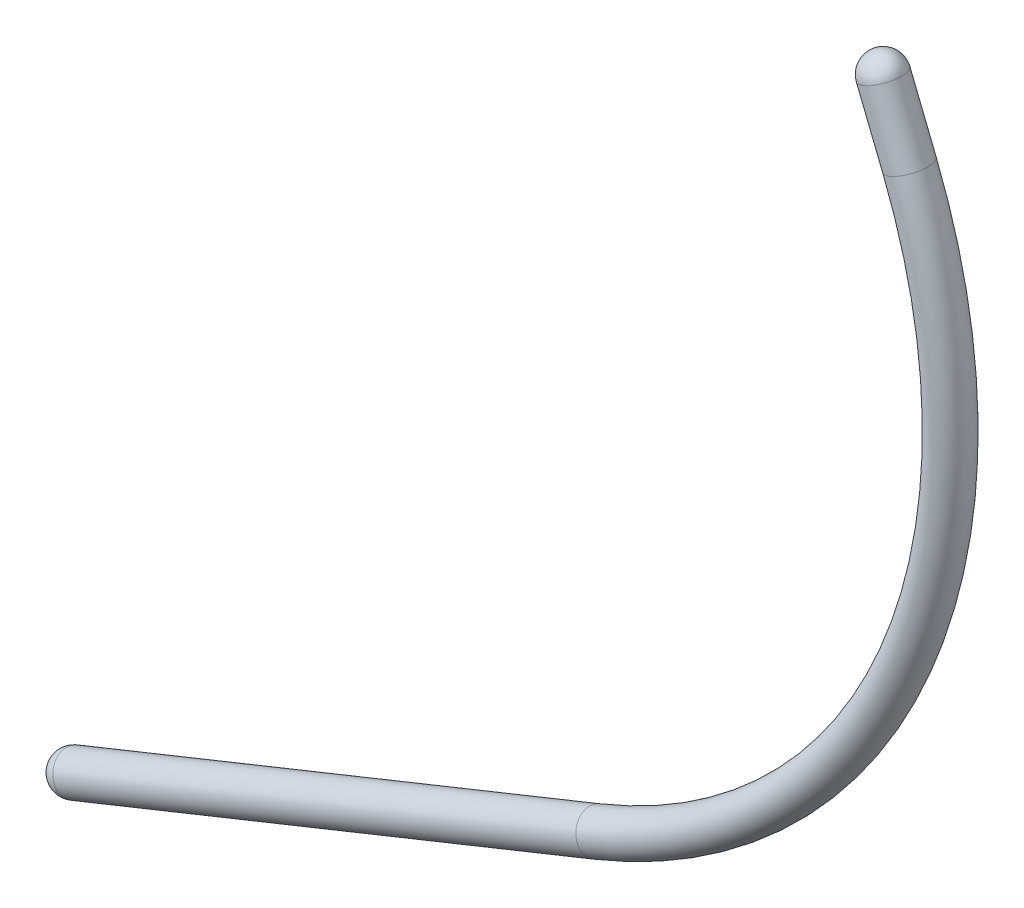
ISO-10303-21;
HEADER;
FILE_DESCRIPTION(('STEP AP214'),'2;1');
FILE_NAME('part.step','',(''),(''),'','','');
FILE_SCHEMA(('AUTOMOTIVE_DESIGN { 1 0 10303 214 1 1 1 1 }'));
ENDSEC;
DATA;
#1=APPLICATION_CONTEXT('core data for automotive mechanical design processes');
#2=APPLICATION_PROTOCOL_DEFINITION('international standard','automotive_design',2000,#1);
#3=PRODUCT_CONTEXT('',#1,'mechanical');
#4=PRODUCT('Part','Part','',(#3));
#5=PRODUCT_RELATED_PRODUCT_CATEGORY('part','',(#4));
#6=PRODUCT_DEFINITION_FORMATION('','',#4);
#7=PRODUCT_DEFINITION_CONTEXT('part definition',#1,'design');
#8=PRODUCT_DEFINITION('design','',#6,#7);
#9=PRODUCT_DEFINITION_SHAPE('','',#8);
#10=(LENGTH_UNIT() NAMED_UNIT(*) SI_UNIT(.MILLI.,.METRE.));
#11=(NAMED_UNIT(*) PLANE_ANGLE_UNIT() SI_UNIT($,.RADIAN.));
#12=(NAMED_UNIT(*) SI_UNIT($,.STERADIAN.) SOLID_ANGLE_UNIT());
#13=UNCERTAINTY_MEASURE_WITH_UNIT(LENGTH_MEASURE(1.E-05),#10,'distance_accuracy_value','');
#14=(GEOMETRIC_REPRESENTATION_CONTEXT(3) GLOBAL_UNCERTAINTY_ASSIGNED_CONTEXT((#13)) GLOBAL_UNIT_ASSIGNED_CONTEXT((#10,
#11,#12)) REPRESENTATION_CONTEXT('',''));
#15=CARTESIAN_POINT('',(0.,0.,0.));
#16=DIRECTION('',(0.,0.,1.));
#17=DIRECTION('',(1.,0.,0.));
#18=AXIS2_PLACEMENT_3D('',#15,#16,#17);
#19=CARTESIAN_POINT('',(-22.2587759214956,79.972270586641,0.));
#20=DIRECTION('',(0.373333333333334,-0.927697268629277,0.));
#21=DIRECTION('',(0.927697268629278,0.373333333333334,0.));
#22=AXIS2_PLACEMENT_3D('',#19,#20,#21);
#23=CYLINDRICAL_SURFACE('',#22,1.4);
#24=CARTESIAN_POINT('',(-20.3921092548289,75.3337842434946,0.));
#25=DIRECTION('',(0.373333333333334,-0.927697268629278,0.));
#26=DIRECTION('',(0.927697268629278,0.373333333333334,0.));
#27=AXIS2_PLACEMENT_3D('',#24,#25,#26);
#28=CIRCLE('',#27,1.4);
#29=CARTESIAN_POINT('',(-19.0933330787479,75.8564509101612,0.));
#30=VERTEX_POINT('',#29);
#31=EDGE_CURVE('E50',#30,#30,#28,.T.);
#32=ORIENTED_EDGE('',*,*,#31,.F.);
#33=EDGE_LOOP('',(#32));
#34=FACE_BOUND('',#33,.T.);
#35=CARTESIAN_POINT('',(-22.2587759214956,79.972270586641,0.));
#36=DIRECTION('',(0.373333333333334,-0.927697268629277,0.));
#37=DIRECTION('',(0.927697268629278,0.373333333333334,0.));
#38=AXIS2_PLACEMENT_3D('',#35,#36,#37);
#39=CIRCLE('',#38,1.4);
#40=CARTESIAN_POINT('',(-20.9599997454146,80.4949372533077,0.));
#41=VERTEX_POINT('',#40);
#42=EDGE_CURVE('E54',#41,#41,#39,.F.);
#43=ORIENTED_EDGE('',*,*,#42,.F.);
#44=EDGE_LOOP('',(#43));
#45=FACE_BOUND('',#44,.T.);
#46=ADVANCED_FACE('F39',(#34,#45),#23,.T.);
#47=CARTESIAN_POINT('',(-57.5,60.4004509101612,0.));
#48=DIRECTION('',(0.,0.,-1.));
#49=DIRECTION('',(-1.,0.,0.));
#50=AXIS2_PLACEMENT_3D('',#47,#48,#49);
#51=TOROIDAL_SURFACE('',#50,40.,1.4);
#52=CARTESIAN_POINT('',(-42.5666666666667,23.2925601649901,0.));
#53=DIRECTION('',(-0.927697268629278,-0.373333333333334,0.));
#54=DIRECTION('',(0.373333333333334,-0.927697268629278,0.));
#55=AXIS2_PLACEMENT_3D('',#52,#53,#54);
#56=CIRCLE('',#55,1.4);
#57=CARTESIAN_POINT('',(-42.044,21.9937839889091,0.));
#58=VERTEX_POINT('',#57);
#59=EDGE_CURVE('E46',#58,#58,#56,.T.);
#60=CARTESIAN_POINT('',(-57.5,60.4004509101612,0.));
#61=DIRECTION('',(0.,0.,-1.));
#62=DIRECTION('',(-1.,0.,0.));
#63=AXIS2_PLACEMENT_3D('',#60,#61,#62);
#64=CIRCLE('',#63,41.4);
#65=EDGE_CURVE('',#30,#58,#64,.T.);
#66=ORIENTED_EDGE('',*,*,#31,.T.);
#67=ORIENTED_EDGE('',*,*,#59,.F.);
#68=ORIENTED_EDGE('',*,*,#65,.T.);
#69=ORIENTED_EDGE('',*,*,#65,.F.);
#70=EDGE_LOOP('',(#66,#68,#67,#69));
#71=FACE_BOUND('',#70,.T.);
#72=ADVANCED_FACE('F63',(#71),#51,.T.);
#73=CARTESIAN_POINT('',(-42.5666666666667,23.2925601649901,0.));
#74=DIRECTION('',(-0.927697268629277,-0.373333333333334,0.));
#75=DIRECTION('',(0.373333333333334,-0.927697268629277,0.));
#76=AXIS2_PLACEMENT_3D('',#73,#74,#75);
#77=CYLINDRICAL_SURFACE('',#76,1.4);
#78=CARTESIAN_POINT('',(-79.6745574118378,8.35922683165678,0.));
#79=DIRECTION('',(-0.927697268629278,-0.373333333333334,0.));
#80=DIRECTION('',(0.373333333333334,-0.927697268629278,0.));
#81=AXIS2_PLACEMENT_3D('',#78,#79,#80);
#82=CIRCLE('',#81,1.4);
#83=CARTESIAN_POINT('',(-79.1518907451711,7.06045065557579,0.));
#84=VERTEX_POINT('',#83);
#85=EDGE_CURVE('E10',#84,#84,#82,.T.);
#86=ORIENTED_EDGE('',*,*,#85,.F.);
#87=EDGE_LOOP('',(#86));
#88=FACE_BOUND('',#87,.T.);
#89=ORIENTED_EDGE('',*,*,#59,.T.);
#90=EDGE_LOOP('',(#89));
#91=FACE_BOUND('',#90,.T.);
#92=ADVANCED_FACE('F41',(#88,#91),#77,.T.);
#93=CARTESIAN_POINT('',(-79.6745574118378,8.35922683165676,0.));
#94=DIRECTION('',(-0.373333333333336,0.927697268629276,0.));
#95=DIRECTION('',(0.,0.,1.));
#96=AXIS2_PLACEMENT_3D('',#93,#94,#95);
#97=SPHERICAL_SURFACE('',#96,1.4);
#98=CARTESIAN_POINT('',(-79.6745574118378,8.35922683165676,0.));
#99=DIRECTION('',(-0.927697268629278,-0.373333333333334,0.));
#100=DIRECTION('',(0.373333333333334,-0.927697268629278,0.));
#101=AXIS2_PLACEMENT_3D('',#98,#99,#100);
#102=SPHERICAL_SURFACE('',#101,1.4);
#103=ORIENTED_EDGE('',*,*,#85,.T.);
#104=EDGE_LOOP('',(#103));
#105=FACE_BOUND('',#104,.T.);
#106=ADVANCED_FACE('F66',(#105),#102,.T.);
#107=CARTESIAN_POINT('',(-22.2587759214956,79.972270586641,0.));
#108=DIRECTION('',(-0.927697268629278,-0.373333333333332,0.));
#109=DIRECTION('',(0.,0.,-1.));
#110=AXIS2_PLACEMENT_3D('',#107,#108,#109);
#111=SPHERICAL_SURFACE('',#110,1.4);
#112=CARTESIAN_POINT('',(-22.2587759214956,79.972270586641,0.));
#113=DIRECTION('',(0.373333333333334,-0.927697268629278,0.));
#114=DIRECTION('',(0.927697268629277,0.373333333333334,0.));
#115=AXIS2_PLACEMENT_3D('',#112,#113,#114);
#116=SPHERICAL_SURFACE('',#115,1.4);
#117=ORIENTED_EDGE('',*,*,#42,.T.);
#118=EDGE_LOOP('',(#117));
#119=FACE_BOUND('',#118,.T.);
#120=ADVANCED_FACE('F60',(#119),#116,.T.);
#121=CLOSED_SHELL('',(#46,#72,#92,#106,#120));
#122=MANIFOLD_SOLID_BREP('B2',#121);
#123=ADVANCED_BREP_SHAPE_REPRESENTATION('',(#18,#122),#14);
#124=SHAPE_DEFINITION_REPRESENTATION(#9,#123);
ENDSEC;
END-ISO-10303-21;
